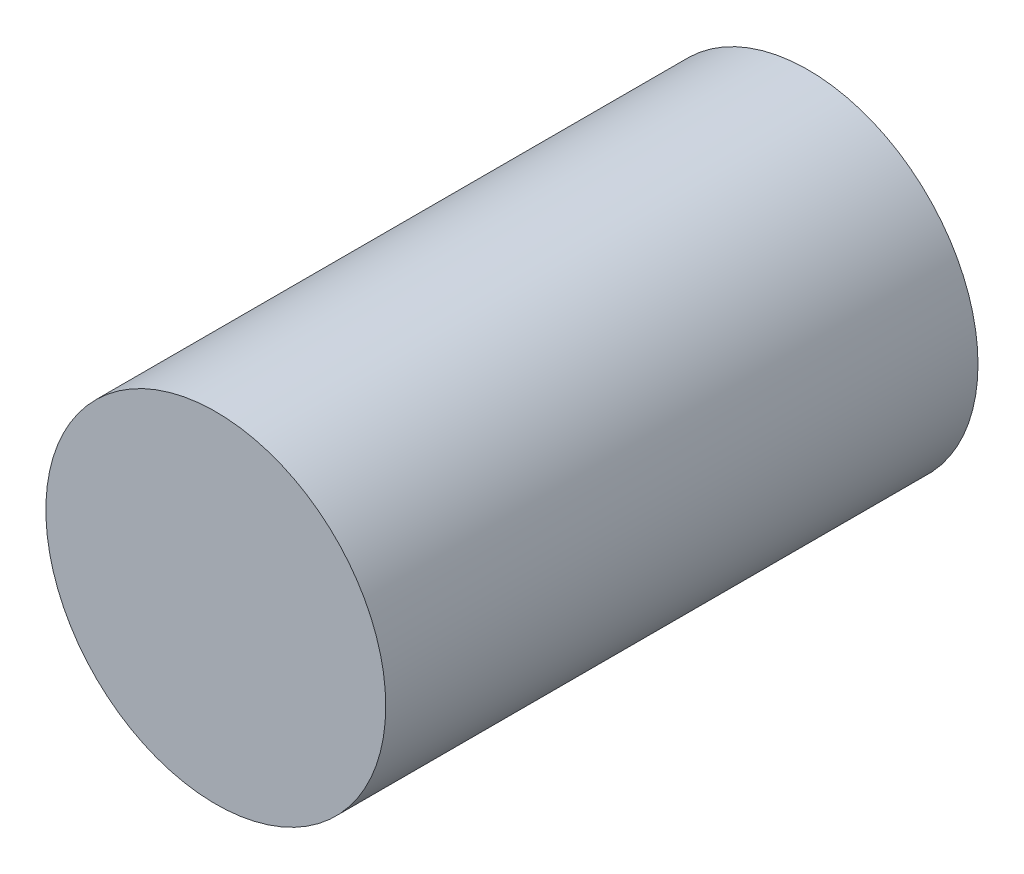
ISO-10303-21;
HEADER;
FILE_DESCRIPTION(('STEP AP214'),'2;1');
FILE_NAME('part.step','',(''),(''),'','','');
FILE_SCHEMA(('AUTOMOTIVE_DESIGN { 1 0 10303 214 1 1 1 1 }'));
ENDSEC;
DATA;
#1=APPLICATION_CONTEXT('core data for automotive mechanical design processes');
#2=APPLICATION_PROTOCOL_DEFINITION('international standard','automotive_design',2000,#1);
#3=PRODUCT_CONTEXT('',#1,'mechanical');
#4=PRODUCT('Part','Part','',(#3));
#5=PRODUCT_RELATED_PRODUCT_CATEGORY('part','',(#4));
#6=PRODUCT_DEFINITION_FORMATION('','',#4);
#7=PRODUCT_DEFINITION_CONTEXT('part definition',#1,'design');
#8=PRODUCT_DEFINITION('design','',#6,#7);
#9=PRODUCT_DEFINITION_SHAPE('','',#8);
#10=(LENGTH_UNIT() NAMED_UNIT(*) SI_UNIT(.MILLI.,.METRE.));
#11=(NAMED_UNIT(*) PLANE_ANGLE_UNIT() SI_UNIT($,.RADIAN.));
#12=(NAMED_UNIT(*) SI_UNIT($,.STERADIAN.) SOLID_ANGLE_UNIT());
#13=UNCERTAINTY_MEASURE_WITH_UNIT(LENGTH_MEASURE(1.E-05),#10,'distance_accuracy_value','');
#14=(GEOMETRIC_REPRESENTATION_CONTEXT(3) GLOBAL_UNCERTAINTY_ASSIGNED_CONTEXT((#13)) GLOBAL_UNIT_ASSIGNED_CONTEXT((#10,
#11,#12)) REPRESENTATION_CONTEXT('',''));
#15=CARTESIAN_POINT('',(0.,0.,0.));
#16=DIRECTION('',(0.,0.,1.));
#17=DIRECTION('',(1.,0.,0.));
#18=AXIS2_PLACEMENT_3D('',#15,#16,#17);
#19=CARTESIAN_POINT('',(0.,0.,115.));
#20=DIRECTION('',(0.,0.,-1.));
#21=DIRECTION('',(-1.,0.,0.));
#22=AXIS2_PLACEMENT_3D('',#19,#20,#21);
#23=CYLINDRICAL_SURFACE('',#22,33.);
#24=CARTESIAN_POINT('',(0.,0.,115.));
#25=DIRECTION('',(0.,0.,1.));
#26=DIRECTION('',(1.,0.,0.));
#27=AXIS2_PLACEMENT_3D('',#24,#25,#26);
#28=CIRCLE('',#27,33.);
#29=CARTESIAN_POINT('',(33.,0.,115.));
#30=VERTEX_POINT('',#29);
#31=EDGE_CURVE('E10',#30,#30,#28,.T.);
#32=ORIENTED_EDGE('',*,*,#31,.F.);
#33=EDGE_LOOP('',(#32));
#34=FACE_BOUND('',#33,.T.);
#35=CARTESIAN_POINT('',(0.,0.,0.));
#36=DIRECTION('',(0.,0.,1.));
#37=DIRECTION('',(1.,0.,0.));
#38=AXIS2_PLACEMENT_3D('',#35,#36,#37);
#39=CIRCLE('',#38,33.);
#40=CARTESIAN_POINT('',(33.,0.,0.));
#41=VERTEX_POINT('',#40);
#42=EDGE_CURVE('E40',#41,#41,#39,.T.);
#43=ORIENTED_EDGE('',*,*,#42,.T.);
#44=EDGE_LOOP('',(#43));
#45=FACE_BOUND('',#44,.T.);
#46=ADVANCED_FACE('F37',(#34,#45),#23,.T.);
#47=CARTESIAN_POINT('',(0.,0.,115.));
#48=DIRECTION('',(0.,0.,1.));
#49=DIRECTION('',(1.,0.,0.));
#50=AXIS2_PLACEMENT_3D('',#47,#48,#49);
#51=PLANE('',#50);
#52=ORIENTED_EDGE('',*,*,#31,.T.);
#53=EDGE_LOOP('',(#52));
#54=FACE_BOUND('',#53,.T.);
#55=ADVANCED_FACE('F54',(#54),#51,.T.);
#56=CARTESIAN_POINT('',(0.,0.,0.));
#57=DIRECTION('',(0.,0.,1.));
#58=DIRECTION('',(1.,0.,0.));
#59=AXIS2_PLACEMENT_3D('',#56,#57,#58);
#60=PLANE('',#59);
#61=ORIENTED_EDGE('',*,*,#42,.F.);
#62=EDGE_LOOP('',(#61));
#63=FACE_BOUND('',#62,.T.);
#64=ADVANCED_FACE('F52',(#63),#60,.F.);
#65=CLOSED_SHELL('',(#46,#55,#64));
#66=MANIFOLD_SOLID_BREP('B2',#65);
#67=ADVANCED_BREP_SHAPE_REPRESENTATION('',(#18,#66),#14);
#68=SHAPE_DEFINITION_REPRESENTATION(#9,#67);
ENDSEC;
END-ISO-10303-21;
